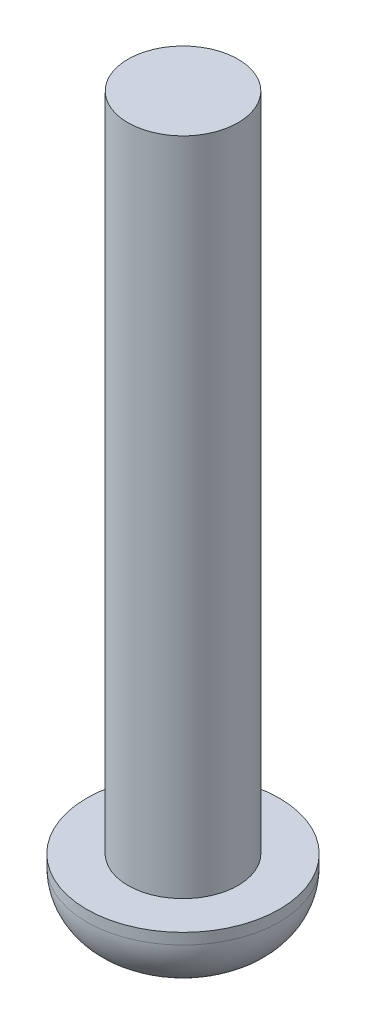
ISO-10303-21;
HEADER;
FILE_DESCRIPTION(('STEP AP214'),'2;1');
FILE_NAME('part.step','',(''),(''),'','','');
FILE_SCHEMA(('AUTOMOTIVE_DESIGN { 1 0 10303 214 1 1 1 1 }'));
ENDSEC;
DATA;
#1=APPLICATION_CONTEXT('core data for automotive mechanical design processes');
#2=APPLICATION_PROTOCOL_DEFINITION('international standard','automotive_design',2000,#1);
#3=PRODUCT_CONTEXT('',#1,'mechanical');
#4=PRODUCT('Part','Part','',(#3));
#5=PRODUCT_RELATED_PRODUCT_CATEGORY('part','',(#4));
#6=PRODUCT_DEFINITION_FORMATION('','',#4);
#7=PRODUCT_DEFINITION_CONTEXT('part definition',#1,'design');
#8=PRODUCT_DEFINITION('design','',#6,#7);
#9=PRODUCT_DEFINITION_SHAPE('','',#8);
#10=(LENGTH_UNIT() NAMED_UNIT(*) SI_UNIT(.MILLI.,.METRE.));
#11=(NAMED_UNIT(*) PLANE_ANGLE_UNIT() SI_UNIT($,.RADIAN.));
#12=(NAMED_UNIT(*) SI_UNIT($,.STERADIAN.) SOLID_ANGLE_UNIT());
#13=UNCERTAINTY_MEASURE_WITH_UNIT(LENGTH_MEASURE(1.E-05),#10,'distance_accuracy_value','');
#14=(GEOMETRIC_REPRESENTATION_CONTEXT(3) GLOBAL_UNCERTAINTY_ASSIGNED_CONTEXT((#13)) GLOBAL_UNIT_ASSIGNED_CONTEXT((#10,
#11,#12)) REPRESENTATION_CONTEXT('',''));
#15=CARTESIAN_POINT('',(0.,0.,0.));
#16=DIRECTION('',(0.,0.,1.));
#17=DIRECTION('',(1.,0.,0.));
#18=AXIS2_PLACEMENT_3D('',#15,#16,#17);
#19=CARTESIAN_POINT('',(0.,1.2,0.));
#20=DIRECTION('',(0.,1.,0.));
#21=DIRECTION('',(0.,0.,1.));
#22=AXIS2_PLACEMENT_3D('',#19,#20,#21);
#23=PLANE('',#22);
#24=CARTESIAN_POINT('',(0.,1.2,0.));
#25=DIRECTION('',(0.,1.,0.));
#26=DIRECTION('',(0.,0.,1.));
#27=AXIS2_PLACEMENT_3D('',#24,#25,#26);
#28=CIRCLE('',#27,1.75);
#29=CARTESIAN_POINT('',(0.,1.2,1.75));
#30=VERTEX_POINT('',#29);
#31=EDGE_CURVE('E50',#30,#30,#28,.T.);
#32=ORIENTED_EDGE('',*,*,#31,.T.);
#33=EDGE_LOOP('',(#32));
#34=FACE_BOUND('',#33,.T.);
#35=CARTESIAN_POINT('',(0.,1.2,0.));
#36=DIRECTION('',(0.,1.,0.));
#37=DIRECTION('',(0.,0.,1.));
#38=AXIS2_PLACEMENT_3D('',#35,#36,#37);
#39=CIRCLE('',#38,1.);
#40=CARTESIAN_POINT('',(0.,1.2,1.));
#41=VERTEX_POINT('',#40);
#42=EDGE_CURVE('E58',#41,#41,#39,.T.);
#43=ORIENTED_EDGE('',*,*,#42,.F.);
#44=EDGE_LOOP('',(#43));
#45=FACE_BOUND('',#44,.T.);
#46=ADVANCED_FACE('F37',(#34,#45),#23,.T.);
#47=CARTESIAN_POINT('',(0.,1.2,0.));
#48=DIRECTION('',(0.,-1.,0.));
#49=DIRECTION('',(0.,0.,-1.));
#50=AXIS2_PLACEMENT_3D('',#47,#48,#49);
#51=CYLINDRICAL_SURFACE('',#50,1.75);
#52=CARTESIAN_POINT('',(0.,1.,0.));
#53=DIRECTION('',(0.,1.,0.));
#54=DIRECTION('',(0.,0.,1.));
#55=AXIS2_PLACEMENT_3D('',#52,#53,#54);
#56=CIRCLE('',#55,1.75);
#57=CARTESIAN_POINT('',(0.,1.,1.75));
#58=VERTEX_POINT('',#57);
#59=EDGE_CURVE('E45',#58,#58,#56,.T.);
#60=ORIENTED_EDGE('',*,*,#59,.T.);
#61=EDGE_LOOP('',(#60));
#62=FACE_BOUND('',#61,.T.);
#63=ORIENTED_EDGE('',*,*,#31,.F.);
#64=EDGE_LOOP('',(#63));
#65=FACE_BOUND('',#64,.T.);
#66=ADVANCED_FACE('F76',(#62,#65),#51,.T.);
#67=CARTESIAN_POINT('',(0.,0.,0.));
#68=DIRECTION('',(0.,1.,0.));
#69=DIRECTION('',(0.,0.,1.));
#70=AXIS2_PLACEMENT_3D('',#67,#68,#69);
#71=PLANE('',#70);
#72=CARTESIAN_POINT('',(0.,0.,0.));
#73=DIRECTION('',(0.,1.,0.));
#74=DIRECTION('',(0.,0.,1.));
#75=AXIS2_PLACEMENT_3D('',#72,#73,#74);
#76=CIRCLE('',#75,0.75);
#77=CARTESIAN_POINT('',(0.,0.,0.75));
#78=VERTEX_POINT('',#77);
#79=EDGE_CURVE('E10',#78,#78,#76,.F.);
#80=ORIENTED_EDGE('',*,*,#79,.T.);
#81=EDGE_LOOP('',(#80));
#82=FACE_BOUND('',#81,.T.);
#83=ADVANCED_FACE('F71',(#82),#71,.F.);
#84=CARTESIAN_POINT('',(0.,13.2,0.));
#85=DIRECTION('',(0.,-1.,0.));
#86=DIRECTION('',(0.,0.,-1.));
#87=AXIS2_PLACEMENT_3D('',#84,#85,#86);
#88=CYLINDRICAL_SURFACE('',#87,1.);
#89=CARTESIAN_POINT('',(0.,13.2,0.));
#90=DIRECTION('',(0.,1.,0.));
#91=DIRECTION('',(0.,0.,1.));
#92=AXIS2_PLACEMENT_3D('',#89,#90,#91);
#93=CIRCLE('',#92,1.);
#94=CARTESIAN_POINT('',(0.,13.2,1.));
#95=VERTEX_POINT('',#94);
#96=EDGE_CURVE('E55',#95,#95,#93,.T.);
#97=ORIENTED_EDGE('',*,*,#96,.F.);
#98=EDGE_LOOP('',(#97));
#99=FACE_BOUND('',#98,.T.);
#100=ORIENTED_EDGE('',*,*,#42,.T.);
#101=EDGE_LOOP('',(#100));
#102=FACE_BOUND('',#101,.T.);
#103=ADVANCED_FACE('F68',(#99,#102),#88,.T.);
#104=CARTESIAN_POINT('',(0.,13.2,0.));
#105=DIRECTION('',(0.,1.,0.));
#106=DIRECTION('',(0.,0.,1.));
#107=AXIS2_PLACEMENT_3D('',#104,#105,#106);
#108=PLANE('',#107);
#109=ORIENTED_EDGE('',*,*,#96,.T.);
#110=EDGE_LOOP('',(#109));
#111=FACE_BOUND('',#110,.T.);
#112=ADVANCED_FACE('F66',(#111),#108,.T.);
#113=CARTESIAN_POINT('',(0.,1.,0.));
#114=DIRECTION('',(0.,1.,0.));
#115=DIRECTION('',(0.,0.,1.));
#116=AXIS2_PLACEMENT_3D('',#113,#114,#115);
#117=DEGENERATE_TOROIDAL_SURFACE('',#116,0.75,1.,.T.);
#118=ORIENTED_EDGE('',*,*,#79,.F.);
#119=EDGE_LOOP('',(#118));
#120=FACE_BOUND('',#119,.T.);
#121=ORIENTED_EDGE('',*,*,#59,.F.);
#122=EDGE_LOOP('',(#121));
#123=FACE_BOUND('',#122,.T.);
#124=ADVANCED_FACE('F39',(#120,#123),#117,.T.);
#125=CLOSED_SHELL('',(#46,#66,#83,#103,#112,#124));
#126=MANIFOLD_SOLID_BREP('B2',#125);
#127=ADVANCED_BREP_SHAPE_REPRESENTATION('',(#18,#126),#14);
#128=SHAPE_DEFINITION_REPRESENTATION(#9,#127);
ENDSEC;
END-ISO-10303-21;
